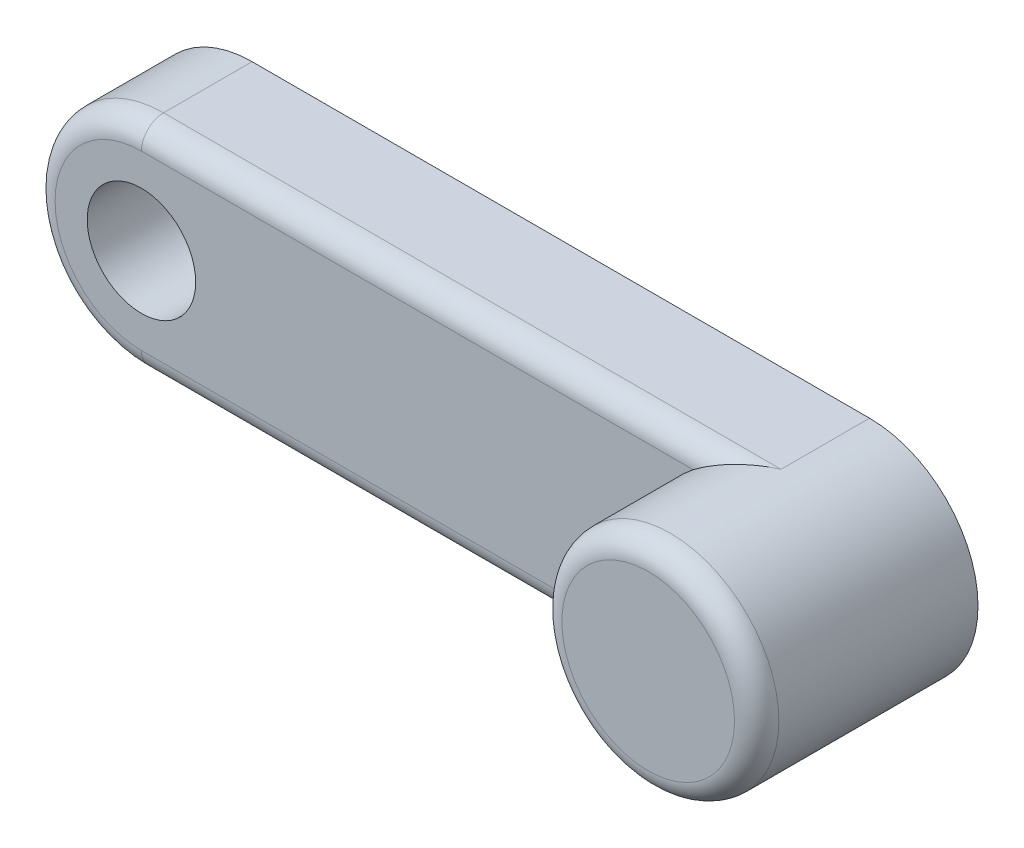
ISO-10303-21;
HEADER;
FILE_DESCRIPTION(('STEP AP214'),'2;1');
FILE_NAME('part.step','',(''),(''),'','','');
FILE_SCHEMA(('AUTOMOTIVE_DESIGN { 1 0 10303 214 1 1 1 1 }'));
ENDSEC;
DATA;
#1=APPLICATION_CONTEXT('core data for automotive mechanical design processes');
#2=APPLICATION_PROTOCOL_DEFINITION('international standard','automotive_design',2000,#1);
#3=PRODUCT_CONTEXT('',#1,'mechanical');
#4=PRODUCT('Part','Part','',(#3));
#5=PRODUCT_RELATED_PRODUCT_CATEGORY('part','',(#4));
#6=PRODUCT_DEFINITION_FORMATION('','',#4);
#7=PRODUCT_DEFINITION_CONTEXT('part definition',#1,'design');
#8=PRODUCT_DEFINITION('design','',#6,#7);
#9=PRODUCT_DEFINITION_SHAPE('','',#8);
#10=(LENGTH_UNIT() NAMED_UNIT(*) SI_UNIT(.MILLI.,.METRE.));
#11=(NAMED_UNIT(*) PLANE_ANGLE_UNIT() SI_UNIT($,.RADIAN.));
#12=(NAMED_UNIT(*) SI_UNIT($,.STERADIAN.) SOLID_ANGLE_UNIT());
#13=UNCERTAINTY_MEASURE_WITH_UNIT(LENGTH_MEASURE(1.E-05),#10,'distance_accuracy_value','');
#14=(GEOMETRIC_REPRESENTATION_CONTEXT(3) GLOBAL_UNCERTAINTY_ASSIGNED_CONTEXT((#13)) GLOBAL_UNIT_ASSIGNED_CONTEXT((#10,
#11,#12)) REPRESENTATION_CONTEXT('',''));
#15=CARTESIAN_POINT('',(0.,0.,0.));
#16=DIRECTION('',(0.,0.,1.));
#17=DIRECTION('',(1.,0.,0.));
#18=AXIS2_PLACEMENT_3D('',#15,#16,#17);
#19=CARTESIAN_POINT('',(0.,0.,5.));
#20=DIRECTION('',(0.,0.,1.));
#21=DIRECTION('',(1.,0.,0.));
#22=AXIS2_PLACEMENT_3D('',#19,#20,#21);
#23=PLANE('',#22);
#24=CARTESIAN_POINT('',(27.899102922647,0.,5.));
#25=DIRECTION('',(0.,0.,1.));
#26=DIRECTION('',(1.,0.,0.));
#27=AXIS2_PLACEMENT_3D('',#24,#25,#26);
#28=CIRCLE('',#27,4.9);
#29=CARTESIAN_POINT('',(24.9326235278088,3.9,5.));
#30=VERTEX_POINT('',#29);
#31=CARTESIAN_POINT('',(24.9326235278088,-3.9,5.));
#32=VERTEX_POINT('',#31);
#33=EDGE_CURVE('E208',#30,#32,#28,.T.);
#34=ORIENTED_EDGE('',*,*,#33,.F.);
#35=DIRECTION('',(-1.,0.,0.));
#36=VECTOR('',#35,1.);
#37=CARTESIAN_POINT('',(0.,3.9,5.));
#38=LINE('',#37,#36);
#39=CARTESIAN_POINT('',(0.,3.9,5.));
#40=VERTEX_POINT('',#39);
#41=EDGE_CURVE('E125',#30,#40,#38,.T.);
#42=ORIENTED_EDGE('',*,*,#41,.T.);
#43=CARTESIAN_POINT('',(0.,0.,5.));
#44=DIRECTION('',(0.,0.,1.));
#45=DIRECTION('',(1.,0.,0.));
#46=AXIS2_PLACEMENT_3D('',#43,#44,#45);
#47=CIRCLE('',#46,3.9);
#48=CARTESIAN_POINT('',(0.,-3.9,5.));
#49=VERTEX_POINT('',#48);
#50=EDGE_CURVE('E92',#40,#49,#47,.T.);
#51=ORIENTED_EDGE('',*,*,#50,.T.);
#52=DIRECTION('',(1.,0.,0.));
#53=VECTOR('',#52,1.);
#54=CARTESIAN_POINT('',(27.899102922647,-3.9,5.));
#55=LINE('',#54,#53);
#56=EDGE_CURVE('E123',#49,#32,#55,.T.);
#57=ORIENTED_EDGE('',*,*,#56,.T.);
#58=EDGE_LOOP('',(#34,#42,#51,#57));
#59=FACE_BOUND('',#58,.T.);
#60=CARTESIAN_POINT('',(0.,0.,5.));
#61=DIRECTION('',(0.,0.,1.));
#62=DIRECTION('',(1.,0.,0.));
#63=AXIS2_PLACEMENT_3D('',#60,#61,#62);
#64=CIRCLE('',#63,2.45);
#65=CARTESIAN_POINT('',(2.45,0.,5.));
#66=VERTEX_POINT('',#65);
#67=EDGE_CURVE('E108',#66,#66,#64,.T.);
#68=ORIENTED_EDGE('',*,*,#67,.F.);
#69=EDGE_LOOP('',(#68));
#70=FACE_BOUND('',#69,.T.);
#71=ADVANCED_FACE('F32',(#59,#70),#23,.T.);
#72=CARTESIAN_POINT('',(0.,0.,0.));
#73=DIRECTION('',(0.,0.,1.));
#74=DIRECTION('',(1.,0.,0.));
#75=AXIS2_PLACEMENT_3D('',#72,#73,#74);
#76=PLANE('',#75);
#77=CARTESIAN_POINT('',(0.,0.,0.));
#78=DIRECTION('',(0.,0.,1.));
#79=DIRECTION('',(1.,0.,0.));
#80=AXIS2_PLACEMENT_3D('',#77,#78,#79);
#81=CIRCLE('',#80,4.9);
#82=CARTESIAN_POINT('',(0.,4.9,0.));
#83=VERTEX_POINT('',#82);
#84=CARTESIAN_POINT('',(0.,-4.9,0.));
#85=VERTEX_POINT('',#84);
#86=EDGE_CURVE('E100',#83,#85,#81,.T.);
#87=ORIENTED_EDGE('',*,*,#86,.F.);
#88=DIRECTION('',(-1.,0.,0.));
#89=VECTOR('',#88,1.);
#90=CARTESIAN_POINT('',(0.,4.9,0.));
#91=LINE('',#90,#89);
#92=CARTESIAN_POINT('',(27.899102922647,4.9,0.));
#93=VERTEX_POINT('',#92);
#94=EDGE_CURVE('E116',#93,#83,#91,.T.);
#95=ORIENTED_EDGE('',*,*,#94,.F.);
#96=CARTESIAN_POINT('',(27.899102922647,0.,0.));
#97=DIRECTION('',(0.,0.,1.));
#98=DIRECTION('',(1.,0.,0.));
#99=AXIS2_PLACEMENT_3D('',#96,#97,#98);
#100=CIRCLE('',#99,4.9);
#101=CARTESIAN_POINT('',(27.899102922647,-4.9,0.));
#102=VERTEX_POINT('',#101);
#103=EDGE_CURVE('E102',#102,#93,#100,.T.);
#104=ORIENTED_EDGE('',*,*,#103,.F.);
#105=DIRECTION('',(1.,0.,0.));
#106=VECTOR('',#105,1.);
#107=CARTESIAN_POINT('',(0.,-4.9,0.));
#108=LINE('',#107,#106);
#109=EDGE_CURVE('E87',#85,#102,#108,.T.);
#110=ORIENTED_EDGE('',*,*,#109,.F.);
#111=EDGE_LOOP('',(#87,#95,#104,#110));
#112=FACE_BOUND('',#111,.T.);
#113=CARTESIAN_POINT('',(0.,0.,0.));
#114=DIRECTION('',(0.,0.,1.));
#115=DIRECTION('',(1.,0.,0.));
#116=AXIS2_PLACEMENT_3D('',#113,#114,#115);
#117=CIRCLE('',#116,2.45);
#118=CARTESIAN_POINT('',(2.45,0.,0.));
#119=VERTEX_POINT('',#118);
#120=EDGE_CURVE('E111',#119,#119,#117,.T.);
#121=ORIENTED_EDGE('',*,*,#120,.T.);
#122=EDGE_LOOP('',(#121));
#123=FACE_BOUND('',#122,.T.);
#124=ADVANCED_FACE('F97',(#112,#123),#76,.F.);
#125=CARTESIAN_POINT('',(0.,0.,5.));
#126=DIRECTION('',(0.,0.,-1.));
#127=DIRECTION('',(-1.,0.,0.));
#128=AXIS2_PLACEMENT_3D('',#125,#126,#127);
#129=CYLINDRICAL_SURFACE('',#128,4.9);
#130=DIRECTION('',(0.,0.,-1.));
#131=VECTOR('',#130,1.);
#132=CARTESIAN_POINT('',(0.,-4.9,5.));
#133=LINE('',#132,#131);
#134=CARTESIAN_POINT('',(0.,-4.9,4.));
#135=VERTEX_POINT('',#134);
#136=EDGE_CURVE('E84',#135,#85,#133,.T.);
#137=ORIENTED_EDGE('',*,*,#136,.F.);
#138=CARTESIAN_POINT('',(0.,0.,4.));
#139=DIRECTION('',(0.,0.,1.));
#140=DIRECTION('',(1.,0.,0.));
#141=AXIS2_PLACEMENT_3D('',#138,#139,#140);
#142=CIRCLE('',#141,4.9);
#143=CARTESIAN_POINT('',(0.,4.9,4.));
#144=VERTEX_POINT('',#143);
#145=EDGE_CURVE('E131',#135,#144,#142,.F.);
#146=ORIENTED_EDGE('',*,*,#145,.T.);
#147=DIRECTION('',(0.,0.,-1.));
#148=VECTOR('',#147,1.);
#149=CARTESIAN_POINT('',(0.,4.9,5.));
#150=LINE('',#149,#148);
#151=EDGE_CURVE('E106',#144,#83,#150,.T.);
#152=ORIENTED_EDGE('',*,*,#151,.T.);
#153=ORIENTED_EDGE('',*,*,#86,.T.);
#154=EDGE_LOOP('',(#137,#146,#152,#153));
#155=FACE_BOUND('',#154,.T.);
#156=ADVANCED_FACE('F104',(#155),#129,.T.);
#157=CARTESIAN_POINT('',(0.,-4.9,5.));
#158=DIRECTION('',(0.,1.,0.));
#159=DIRECTION('',(0.,0.,1.));
#160=AXIS2_PLACEMENT_3D('',#157,#158,#159);
#161=PLANE('',#160);
#162=DIRECTION('',(0.,0.,-1.));
#163=VECTOR('',#162,1.);
#164=CARTESIAN_POINT('',(27.899102922647,-4.9,5.));
#165=LINE('',#164,#163);
#166=CARTESIAN_POINT('',(27.899102922647,-4.9,4.));
#167=VERTEX_POINT('',#166);
#168=EDGE_CURVE('E93',#167,#102,#165,.T.);
#169=ORIENTED_EDGE('',*,*,#168,.F.);
#170=DIRECTION('',(1.,0.,0.));
#171=VECTOR('',#170,1.);
#172=CARTESIAN_POINT('',(0.,-4.9,4.));
#173=LINE('',#172,#171);
#174=EDGE_CURVE('E49',#167,#135,#173,.F.);
#175=ORIENTED_EDGE('',*,*,#174,.T.);
#176=ORIENTED_EDGE('',*,*,#136,.T.);
#177=ORIENTED_EDGE('',*,*,#109,.T.);
#178=EDGE_LOOP('',(#169,#175,#176,#177));
#179=FACE_BOUND('',#178,.T.);
#180=ADVANCED_FACE('F86',(#179),#161,.F.);
#181=CARTESIAN_POINT('',(27.899102922647,0.,5.));
#182=DIRECTION('',(0.,0.,-1.));
#183=DIRECTION('',(-1.,0.,0.));
#184=AXIS2_PLACEMENT_3D('',#181,#182,#183);
#185=CYLINDRICAL_SURFACE('',#184,4.9);
#186=CARTESIAN_POINT('',(27.899102922647,0.,9.));
#187=DIRECTION('',(0.,0.,1.));
#188=DIRECTION('',(1.,0.,0.));
#189=AXIS2_PLACEMENT_3D('',#186,#187,#188);
#190=CIRCLE('',#189,4.9);
#191=CARTESIAN_POINT('',(32.799102922647,0.,9.));
#192=VERTEX_POINT('',#191);
#193=EDGE_CURVE('E136',#192,#192,#190,.F.);
#194=ORIENTED_EDGE('',*,*,#193,.T.);
#195=EDGE_LOOP('',(#194));
#196=FACE_BOUND('',#195,.T.);
#197=ORIENTED_EDGE('',*,*,#103,.T.);
#198=DIRECTION('',(0.,0.,-1.));
#199=VECTOR('',#198,1.);
#200=CARTESIAN_POINT('',(27.899102922647,4.9,5.));
#201=LINE('',#200,#199);
#202=CARTESIAN_POINT('',(27.899102922647,4.9,4.));
#203=VERTEX_POINT('',#202);
#204=EDGE_CURVE('E119',#203,#93,#201,.T.);
#205=ORIENTED_EDGE('',*,*,#204,.F.);
#206=CARTESIAN_POINT('',(24.9326235278088,3.9,5.));
#207=CARTESIAN_POINT('',(24.9942707944653,3.94690417923829,4.99996441485803));
#208=CARTESIAN_POINT('',(25.0569775129089,3.99228093811275,4.99670394148969));
#209=CARTESIAN_POINT('',(25.1839934911987,4.07971640140822,4.9847140858231));
#210=CARTESIAN_POINT('',(25.2482994737231,4.12178125678217,4.97599512444898));
#211=CARTESIAN_POINT('',(25.3777877639251,4.20223155208442,4.95413717995914));
#212=CARTESIAN_POINT('',(25.442960983511,4.24064034183053,4.94102905818646));
#213=CARTESIAN_POINT('',(25.5743874726894,4.3140894976995,4.91110022267383));
#214=CARTESIAN_POINT('',(25.6406414257035,4.34912762744665,4.89427706813177));
#215=CARTESIAN_POINT('',(25.815961406342,4.43680902526966,4.84598322081373));
#216=CARTESIAN_POINT('',(25.9257309643724,4.48665525220561,4.81195716358774));
#217=CARTESIAN_POINT('',(26.1468412411217,4.5775410162518,4.73781952879885));
#218=CARTESIAN_POINT('',(26.2581825969603,4.61857686612518,4.69770541526055));
#219=CARTESIAN_POINT('',(26.4824107522865,4.69222363821565,4.6128219134595));
#220=CARTESIAN_POINT('',(26.5953019475711,4.72480026445258,4.56803457578753));
#221=CARTESIAN_POINT('',(26.8218096171156,4.78153394111423,4.47524083365194));
#222=CARTESIAN_POINT('',(26.9354258569361,4.80569358531326,4.42723542631478));
#223=CARTESIAN_POINT('',(27.1884568662556,4.85025294547417,4.31815147632159));
#224=CARTESIAN_POINT('',(27.3279977531036,4.86862627828956,4.25653716241633));
#225=CARTESIAN_POINT('',(27.6071581730561,4.89329694171383,4.13186637063915));
#226=CARTESIAN_POINT('',(27.7467768952582,4.89962009391263,4.06881327013909));
#227=CARTESIAN_POINT('',(27.8905972921801,4.8999944601066,4.00384245127266));
#228=CARTESIAN_POINT('',(27.8948501345809,4.89999999647679,4.00192121285029));
#229=CARTESIAN_POINT('',(27.899102922647,4.9,4.));
#230=B_SPLINE_CURVE_WITH_KNOTS('',3,(#206,#207,#208,#209,#210,#211,#212,#213,#214,#215,#216,
#217,#218,#219,#220,#221,#222,#223,#224,#225,#226,#227,#228,#229),.UNSPECIFIED.,.F.,.F.,(4,2,2,
2,2,2,2,2,2,2,2,4),(0.,0.232181502958222,0.463921088993647,0.694064321778912,0.924359212515527,
1.29958048125619,1.67495847931384,2.05183540316532,2.42859608581119,2.88902351865956,
3.34846321564086,3.36246322549442),.UNSPECIFIED.);
#231=EDGE_CURVE('E41',#203,#30,#230,.F.);
#232=ORIENTED_EDGE('',*,*,#231,.T.);
#233=ORIENTED_EDGE('',*,*,#33,.T.);
#234=CARTESIAN_POINT('',(24.9326235278088,-3.9,5.));
#235=CARTESIAN_POINT('',(24.9942707944653,-3.94690417923829,4.99996441485803));
#236=CARTESIAN_POINT('',(25.0569775129089,-3.99228093811275,4.99670394148969));
#237=CARTESIAN_POINT('',(25.1839934911987,-4.07971640140822,4.9847140858231));
#238=CARTESIAN_POINT('',(25.2482994737231,-4.12178125678217,4.97599512444898));
#239=CARTESIAN_POINT('',(25.3777877639251,-4.20223155208442,4.95413717995914));
#240=CARTESIAN_POINT('',(25.442960983511,-4.24064034183053,4.94102905818646));
#241=CARTESIAN_POINT('',(25.5743874726894,-4.3140894976995,4.91110022267383));
#242=CARTESIAN_POINT('',(25.6406414257035,-4.34912762744665,4.89427706813177));
#243=CARTESIAN_POINT('',(25.815961406342,-4.43680902526966,4.84598322081373));
#244=CARTESIAN_POINT('',(25.9257309643724,-4.48665525220561,4.81195716358774));
#245=CARTESIAN_POINT('',(26.1468412411217,-4.5775410162518,4.73781952879885));
#246=CARTESIAN_POINT('',(26.2581825969603,-4.61857686612518,4.69770541526055));
#247=CARTESIAN_POINT('',(26.4824107522865,-4.69222363821565,4.6128219134595));
#248=CARTESIAN_POINT('',(26.5953019475711,-4.72480026445258,4.56803457578753));
#249=CARTESIAN_POINT('',(26.8218096171156,-4.78153394111423,4.47524083365194));
#250=CARTESIAN_POINT('',(26.9354258569361,-4.80569358531326,4.42723542631478));
#251=CARTESIAN_POINT('',(27.1884568662556,-4.85025294547417,4.31815147632159));
#252=CARTESIAN_POINT('',(27.3279977531036,-4.86862627828956,4.25653716241633));
#253=CARTESIAN_POINT('',(27.6071581730561,-4.89329694171383,4.13186637063915));
#254=CARTESIAN_POINT('',(27.7467768952582,-4.89962009391263,4.06881327013909));
#255=CARTESIAN_POINT('',(27.8905972921801,-4.8999944601066,4.00384245127266));
#256=CARTESIAN_POINT('',(27.8948501345809,-4.89999999647679,4.00192121285029));
#257=CARTESIAN_POINT('',(27.899102922647,-4.9,4.));
#258=B_SPLINE_CURVE_WITH_KNOTS('',3,(#234,#235,#236,#237,#238,#239,#240,#241,#242,#243,#244,
#245,#246,#247,#248,#249,#250,#251,#252,#253,#254,#255,#256,#257),.UNSPECIFIED.,.F.,.F.,(4,2,2,
2,2,2,2,2,2,2,2,4),(0.,0.232181502958222,0.463921088993647,0.694064321778912,0.924359212515527,
1.29958048125619,1.67495847931384,2.05183540316532,2.42859608581119,2.88902351865956,
3.34846321564086,3.36246322549442),.UNSPECIFIED.);
#259=EDGE_CURVE('E11',#32,#167,#258,.T.);
#260=ORIENTED_EDGE('',*,*,#259,.T.);
#261=ORIENTED_EDGE('',*,*,#168,.T.);
#262=EDGE_LOOP('',(#197,#205,#232,#233,#260,#261));
#263=FACE_BOUND('',#262,.T.);
#264=ADVANCED_FACE('F153',(#196,#263),#185,.T.);
#265=CARTESIAN_POINT('',(0.,4.9,5.));
#266=DIRECTION('',(0.,-1.,0.));
#267=DIRECTION('',(0.,0.,-1.));
#268=AXIS2_PLACEMENT_3D('',#265,#266,#267);
#269=PLANE('',#268);
#270=ORIENTED_EDGE('',*,*,#151,.F.);
#271=DIRECTION('',(-1.,0.,0.));
#272=VECTOR('',#271,1.);
#273=CARTESIAN_POINT('',(27.899102922647,4.9,4.));
#274=LINE('',#273,#272);
#275=EDGE_CURVE('E128',#144,#203,#274,.F.);
#276=ORIENTED_EDGE('',*,*,#275,.T.);
#277=ORIENTED_EDGE('',*,*,#204,.T.);
#278=ORIENTED_EDGE('',*,*,#94,.T.);
#279=EDGE_LOOP('',(#270,#276,#277,#278));
#280=FACE_BOUND('',#279,.T.);
#281=ADVANCED_FACE('F158',(#280),#269,.F.);
#282=CARTESIAN_POINT('',(0.,0.,5.));
#283=DIRECTION('',(0.,0.,-1.));
#284=DIRECTION('',(-1.,0.,0.));
#285=AXIS2_PLACEMENT_3D('',#282,#283,#284);
#286=CYLINDRICAL_SURFACE('',#285,2.45);
#287=ORIENTED_EDGE('',*,*,#67,.T.);
#288=EDGE_LOOP('',(#287));
#289=FACE_BOUND('',#288,.T.);
#290=ORIENTED_EDGE('',*,*,#120,.F.);
#291=EDGE_LOOP('',(#290));
#292=FACE_BOUND('',#291,.T.);
#293=ADVANCED_FACE('F175',(#289,#292),#286,.F.);
#294=CARTESIAN_POINT('',(27.899102922647,0.,10.));
#295=DIRECTION('',(0.,0.,1.));
#296=DIRECTION('',(1.,0.,0.));
#297=AXIS2_PLACEMENT_3D('',#294,#295,#296);
#298=PLANE('',#297);
#299=CARTESIAN_POINT('',(27.899102922647,0.,10.));
#300=DIRECTION('',(0.,0.,1.));
#301=DIRECTION('',(1.,0.,0.));
#302=AXIS2_PLACEMENT_3D('',#299,#300,#301);
#303=CIRCLE('',#302,3.9);
#304=CARTESIAN_POINT('',(31.799102922647,0.,10.));
#305=VERTEX_POINT('',#304);
#306=EDGE_CURVE('E133',#305,#305,#303,.T.);
#307=ORIENTED_EDGE('',*,*,#306,.T.);
#308=EDGE_LOOP('',(#307));
#309=FACE_BOUND('',#308,.T.);
#310=ADVANCED_FACE('F178',(#309),#298,.T.);
#311=CARTESIAN_POINT('',(0.,-3.9,4.));
#312=DIRECTION('',(-1.,0.,0.));
#313=DIRECTION('',(0.,0.,1.));
#314=AXIS2_PLACEMENT_3D('',#311,#312,#313);
#315=CYLINDRICAL_SURFACE('',#314,1.);
#316=ORIENTED_EDGE('',*,*,#259,.F.);
#317=ORIENTED_EDGE('',*,*,#56,.F.);
#318=CARTESIAN_POINT('',(0.,-3.9,4.));
#319=DIRECTION('',(-1.,0.,0.));
#320=DIRECTION('',(0.,0.,1.));
#321=AXIS2_PLACEMENT_3D('',#318,#319,#320);
#322=CIRCLE('',#321,1.);
#323=EDGE_CURVE('E36',#135,#49,#322,.T.);
#324=ORIENTED_EDGE('',*,*,#323,.F.);
#325=ORIENTED_EDGE('',*,*,#174,.F.);
#326=EDGE_LOOP('',(#316,#317,#324,#325));
#327=FACE_BOUND('',#326,.T.);
#328=ADVANCED_FACE('F181',(#327),#315,.T.);
#329=CARTESIAN_POINT('',(0.,0.,4.));
#330=DIRECTION('',(0.,0.,1.));
#331=DIRECTION('',(1.,0.,0.));
#332=AXIS2_PLACEMENT_3D('',#329,#330,#331);
#333=TOROIDAL_SURFACE('',#332,3.9,1.);
#334=ORIENTED_EDGE('',*,*,#323,.T.);
#335=ORIENTED_EDGE('',*,*,#50,.F.);
#336=CARTESIAN_POINT('',(0.,3.9,4.));
#337=DIRECTION('',(1.,0.,0.));
#338=DIRECTION('',(0.,0.,-1.));
#339=AXIS2_PLACEMENT_3D('',#336,#337,#338);
#340=CIRCLE('',#339,1.);
#341=EDGE_CURVE('E203',#144,#40,#340,.T.);
#342=ORIENTED_EDGE('',*,*,#341,.F.);
#343=ORIENTED_EDGE('',*,*,#145,.F.);
#344=EDGE_LOOP('',(#334,#335,#342,#343));
#345=FACE_BOUND('',#344,.T.);
#346=ADVANCED_FACE('F186',(#345),#333,.T.);
#347=CARTESIAN_POINT('',(0.,3.9,4.));
#348=DIRECTION('',(1.,0.,0.));
#349=DIRECTION('',(0.,0.,-1.));
#350=AXIS2_PLACEMENT_3D('',#347,#348,#349);
#351=CYLINDRICAL_SURFACE('',#350,1.);
#352=ORIENTED_EDGE('',*,*,#231,.F.);
#353=ORIENTED_EDGE('',*,*,#275,.F.);
#354=ORIENTED_EDGE('',*,*,#341,.T.);
#355=ORIENTED_EDGE('',*,*,#41,.F.);
#356=EDGE_LOOP('',(#352,#353,#354,#355));
#357=FACE_BOUND('',#356,.T.);
#358=ADVANCED_FACE('F149',(#357),#351,.T.);
#359=CARTESIAN_POINT('',(27.899102922647,0.,9.));
#360=DIRECTION('',(0.,0.,1.));
#361=DIRECTION('',(1.,0.,0.));
#362=AXIS2_PLACEMENT_3D('',#359,#360,#361);
#363=TOROIDAL_SURFACE('',#362,3.9,1.);
#364=ORIENTED_EDGE('',*,*,#193,.F.);
#365=EDGE_LOOP('',(#364));
#366=FACE_BOUND('',#365,.T.);
#367=ORIENTED_EDGE('',*,*,#306,.F.);
#368=EDGE_LOOP('',(#367));
#369=FACE_BOUND('',#368,.T.);
#370=ADVANCED_FACE('F34',(#366,#369),#363,.T.);
#371=CLOSED_SHELL('',(#71,#124,#156,#180,#264,#281,#293,#310,#328,#346,#358,#370));
#372=MANIFOLD_SOLID_BREP('B2',#371);
#373=ADVANCED_BREP_SHAPE_REPRESENTATION('',(#18,#372),#14);
#374=SHAPE_DEFINITION_REPRESENTATION(#9,#373);
ENDSEC;
END-ISO-10303-21;
